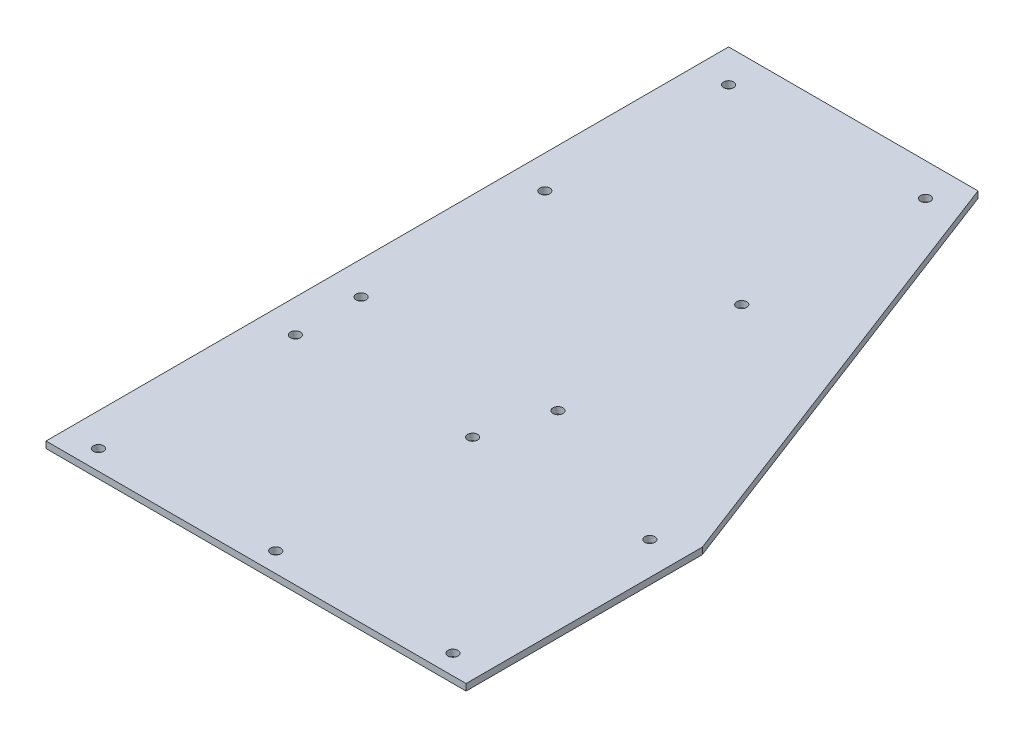
ISO-10303-21;
HEADER;
FILE_DESCRIPTION(('STEP AP214'),'2;1');
FILE_NAME('part.step','',(''),(''),'','','');
FILE_SCHEMA(('AUTOMOTIVE_DESIGN { 1 0 10303 214 1 1 1 1 }'));
ENDSEC;
DATA;
#1=APPLICATION_CONTEXT('core data for automotive mechanical design processes');
#2=APPLICATION_PROTOCOL_DEFINITION('international standard','automotive_design',2000,#1);
#3=PRODUCT_CONTEXT('',#1,'mechanical');
#4=PRODUCT('Part','Part','',(#3));
#5=PRODUCT_RELATED_PRODUCT_CATEGORY('part','',(#4));
#6=PRODUCT_DEFINITION_FORMATION('','',#4);
#7=PRODUCT_DEFINITION_CONTEXT('part definition',#1,'design');
#8=PRODUCT_DEFINITION('design','',#6,#7);
#9=PRODUCT_DEFINITION_SHAPE('','',#8);
#10=(LENGTH_UNIT() NAMED_UNIT(*) SI_UNIT(.MILLI.,.METRE.));
#11=(NAMED_UNIT(*) PLANE_ANGLE_UNIT() SI_UNIT($,.RADIAN.));
#12=(NAMED_UNIT(*) SI_UNIT($,.STERADIAN.) SOLID_ANGLE_UNIT());
#13=UNCERTAINTY_MEASURE_WITH_UNIT(LENGTH_MEASURE(1.E-05),#10,'distance_accuracy_value','');
#14=(GEOMETRIC_REPRESENTATION_CONTEXT(3) GLOBAL_UNCERTAINTY_ASSIGNED_CONTEXT((#13)) GLOBAL_UNIT_ASSIGNED_CONTEXT((#10,
#11,#12)) REPRESENTATION_CONTEXT('',''));
#15=CARTESIAN_POINT('',(0.,0.,0.));
#16=DIRECTION('',(0.,0.,1.));
#17=DIRECTION('',(1.,0.,0.));
#18=AXIS2_PLACEMENT_3D('',#15,#16,#17);
#19=CARTESIAN_POINT('',(0.,3.175,0.));
#20=DIRECTION('',(0.,-1.,0.));
#21=DIRECTION('',(0.,0.,-1.));
#22=AXIS2_PLACEMENT_3D('',#19,#20,#21);
#23=PLANE('',#22);
#24=DIRECTION('',(0.,0.,1.));
#25=VECTOR('',#24,1.);
#26=CARTESIAN_POINT('',(0.,3.175,0.));
#27=LINE('',#26,#25);
#28=CARTESIAN_POINT('',(0.,3.175,-330.2));
#29=VERTEX_POINT('',#28);
#30=CARTESIAN_POINT('',(0.,3.175,0.));
#31=VERTEX_POINT('',#30);
#32=EDGE_CURVE('E117',#29,#31,#27,.T.);
#33=ORIENTED_EDGE('',*,*,#32,.T.);
#34=DIRECTION('',(1.,0.,0.));
#35=VECTOR('',#34,1.);
#36=CARTESIAN_POINT('',(0.,3.175,0.));
#37=LINE('',#36,#35);
#38=CARTESIAN_POINT('',(203.2,3.175,0.));
#39=VERTEX_POINT('',#38);
#40=EDGE_CURVE('E84',#31,#39,#37,.T.);
#41=ORIENTED_EDGE('',*,*,#40,.T.);
#42=DIRECTION('',(0.,0.,-1.));
#43=VECTOR('',#42,1.);
#44=CARTESIAN_POINT('',(203.2,3.175,0.));
#45=LINE('',#44,#43);
#46=CARTESIAN_POINT('',(203.2,3.175,-114.3));
#47=VERTEX_POINT('',#46);
#48=EDGE_CURVE('E88',#39,#47,#45,.T.);
#49=ORIENTED_EDGE('',*,*,#48,.T.);
#50=DIRECTION('',(-0.357137466266591,0.,-0.934051834851085));
#51=VECTOR('',#50,1.);
#52=CARTESIAN_POINT('',(120.65,3.175,-330.2));
#53=LINE('',#52,#51);
#54=CARTESIAN_POINT('',(120.65,3.175,-330.2));
#55=VERTEX_POINT('',#54);
#56=EDGE_CURVE('E92',#47,#55,#53,.T.);
#57=ORIENTED_EDGE('',*,*,#56,.T.);
#58=DIRECTION('',(-1.,0.,0.));
#59=VECTOR('',#58,1.);
#60=CARTESIAN_POINT('',(0.,3.175,-330.2));
#61=LINE('',#60,#59);
#62=EDGE_CURVE('E50',#55,#29,#61,.T.);
#63=ORIENTED_EDGE('',*,*,#62,.T.);
#64=EDGE_LOOP('',(#33,#41,#49,#57,#63));
#65=FACE_BOUND('',#64,.T.);
#66=CARTESIAN_POINT('',(15.875,3.175,-9.525));
#67=DIRECTION('',(0.,1.,0.));
#68=DIRECTION('',(0.,0.,1.));
#69=AXIS2_PLACEMENT_3D('',#66,#67,#68);
#70=CIRCLE('',#69,2.4257);
#71=CARTESIAN_POINT('',(15.875,3.175,-7.0993));
#72=VERTEX_POINT('',#71);
#73=EDGE_CURVE('E112',#72,#72,#70,.T.);
#74=ORIENTED_EDGE('',*,*,#73,.F.);
#75=EDGE_LOOP('',(#74));
#76=FACE_BOUND('',#75,.T.);
#77=CARTESIAN_POINT('',(101.6,3.175,-9.525));
#78=DIRECTION('',(0.,1.,0.));
#79=DIRECTION('',(0.,0.,1.));
#80=AXIS2_PLACEMENT_3D('',#77,#78,#79);
#81=CIRCLE('',#80,2.4257);
#82=CARTESIAN_POINT('',(101.6,3.175,-7.0993));
#83=VERTEX_POINT('',#82);
#84=EDGE_CURVE('E256',#83,#83,#81,.T.);
#85=ORIENTED_EDGE('',*,*,#84,.F.);
#86=EDGE_LOOP('',(#85));
#87=FACE_BOUND('',#86,.T.);
#88=CARTESIAN_POINT('',(187.325,3.175,-9.525));
#89=DIRECTION('',(0.,1.,0.));
#90=DIRECTION('',(0.,0.,1.));
#91=AXIS2_PLACEMENT_3D('',#88,#89,#90);
#92=CIRCLE('',#91,2.4257);
#93=CARTESIAN_POINT('',(187.325,3.175,-7.0993));
#94=VERTEX_POINT('',#93);
#95=EDGE_CURVE('E250',#94,#94,#92,.T.);
#96=ORIENTED_EDGE('',*,*,#95,.F.);
#97=EDGE_LOOP('',(#96));
#98=FACE_BOUND('',#97,.T.);
#99=CARTESIAN_POINT('',(15.8749999999997,3.175,-104.775));
#100=DIRECTION('',(0.,1.,0.));
#101=DIRECTION('',(0.,0.,1.));
#102=AXIS2_PLACEMENT_3D('',#99,#100,#101);
#103=CIRCLE('',#102,2.4257);
#104=CARTESIAN_POINT('',(15.8749999999997,3.175,-102.3493));
#105=VERTEX_POINT('',#104);
#106=EDGE_CURVE('E244',#105,#105,#103,.T.);
#107=ORIENTED_EDGE('',*,*,#106,.F.);
#108=EDGE_LOOP('',(#107));
#109=FACE_BOUND('',#108,.T.);
#110=CARTESIAN_POINT('',(15.875,3.175,-136.525));
#111=DIRECTION('',(0.,1.,0.));
#112=DIRECTION('',(0.,0.,1.));
#113=AXIS2_PLACEMENT_3D('',#110,#111,#112);
#114=CIRCLE('',#113,2.42570000000001);
#115=CARTESIAN_POINT('',(15.875,3.175,-134.0993));
#116=VERTEX_POINT('',#115);
#117=EDGE_CURVE('E238',#116,#116,#114,.T.);
#118=ORIENTED_EDGE('',*,*,#117,.F.);
#119=EDGE_LOOP('',(#118));
#120=FACE_BOUND('',#119,.T.);
#121=CARTESIAN_POINT('',(187.325,3.175,-104.775));
#122=DIRECTION('',(0.,1.,0.));
#123=DIRECTION('',(0.,0.,1.));
#124=AXIS2_PLACEMENT_3D('',#121,#122,#123);
#125=CIRCLE('',#124,2.4257);
#126=CARTESIAN_POINT('',(187.325,3.175,-102.3493));
#127=VERTEX_POINT('',#126);
#128=EDGE_CURVE('E232',#127,#127,#125,.T.);
#129=ORIENTED_EDGE('',*,*,#128,.F.);
#130=EDGE_LOOP('',(#129));
#131=FACE_BOUND('',#130,.T.);
#132=CARTESIAN_POINT('',(101.6,3.175,-104.775));
#133=DIRECTION('',(0.,1.,0.));
#134=DIRECTION('',(0.,0.,1.));
#135=AXIS2_PLACEMENT_3D('',#132,#133,#134);
#136=CIRCLE('',#135,2.4257);
#137=CARTESIAN_POINT('',(101.6,3.175,-102.3493));
#138=VERTEX_POINT('',#137);
#139=EDGE_CURVE('E226',#138,#138,#136,.T.);
#140=ORIENTED_EDGE('',*,*,#139,.F.);
#141=EDGE_LOOP('',(#140));
#142=FACE_BOUND('',#141,.T.);
#143=CARTESIAN_POINT('',(111.125,3.175,-136.525));
#144=DIRECTION('',(0.,1.,0.));
#145=DIRECTION('',(0.,0.,1.));
#146=AXIS2_PLACEMENT_3D('',#143,#144,#145);
#147=CIRCLE('',#146,2.4257);
#148=CARTESIAN_POINT('',(111.125,3.175,-134.0993));
#149=VERTEX_POINT('',#148);
#150=EDGE_CURVE('E220',#149,#149,#147,.T.);
#151=ORIENTED_EDGE('',*,*,#150,.F.);
#152=EDGE_LOOP('',(#151));
#153=FACE_BOUND('',#152,.T.);
#154=CARTESIAN_POINT('',(15.875,3.175,-225.425));
#155=DIRECTION('',(0.,1.,0.));
#156=DIRECTION('',(0.,0.,1.));
#157=AXIS2_PLACEMENT_3D('',#154,#155,#156);
#158=CIRCLE('',#157,2.42570000000002);
#159=CARTESIAN_POINT('',(15.875,3.175,-222.9993));
#160=VERTEX_POINT('',#159);
#161=EDGE_CURVE('E214',#160,#160,#158,.T.);
#162=ORIENTED_EDGE('',*,*,#161,.F.);
#163=EDGE_LOOP('',(#162));
#164=FACE_BOUND('',#163,.T.);
#165=CARTESIAN_POINT('',(15.875,3.175,-314.325));
#166=DIRECTION('',(0.,1.,0.));
#167=DIRECTION('',(0.,0.,1.));
#168=AXIS2_PLACEMENT_3D('',#165,#166,#167);
#169=CIRCLE('',#168,2.42569999999998);
#170=CARTESIAN_POINT('',(15.875,3.175,-311.8993));
#171=VERTEX_POINT('',#170);
#172=EDGE_CURVE('E208',#171,#171,#169,.T.);
#173=ORIENTED_EDGE('',*,*,#172,.F.);
#174=EDGE_LOOP('',(#173));
#175=FACE_BOUND('',#174,.T.);
#176=CARTESIAN_POINT('',(111.125,3.175,-225.425));
#177=DIRECTION('',(0.,1.,0.));
#178=DIRECTION('',(0.,0.,1.));
#179=AXIS2_PLACEMENT_3D('',#176,#177,#178);
#180=CIRCLE('',#179,2.4257);
#181=CARTESIAN_POINT('',(111.125,3.175,-222.9993));
#182=VERTEX_POINT('',#181);
#183=EDGE_CURVE('E202',#182,#182,#180,.T.);
#184=ORIENTED_EDGE('',*,*,#183,.F.);
#185=EDGE_LOOP('',(#184));
#186=FACE_BOUND('',#185,.T.);
#187=CARTESIAN_POINT('',(111.125,3.175,-314.325));
#188=DIRECTION('',(0.,1.,0.));
#189=DIRECTION('',(0.,0.,1.));
#190=AXIS2_PLACEMENT_3D('',#187,#188,#189);
#191=CIRCLE('',#190,2.42569999999999);
#192=CARTESIAN_POINT('',(111.125,3.175,-311.8993));
#193=VERTEX_POINT('',#192);
#194=EDGE_CURVE('E193',#193,#193,#191,.T.);
#195=ORIENTED_EDGE('',*,*,#194,.F.);
#196=EDGE_LOOP('',(#195));
#197=FACE_BOUND('',#196,.T.);
#198=ADVANCED_FACE('F33',(#65,#76,#87,#98,#109,#120,#131,#142,#153,#164,#175,#186,#197),#23,.F.);
#199=CARTESIAN_POINT('',(0.,0.,0.));
#200=DIRECTION('',(0.,-1.,0.));
#201=DIRECTION('',(0.,0.,-1.));
#202=AXIS2_PLACEMENT_3D('',#199,#200,#201);
#203=PLANE('',#202);
#204=CARTESIAN_POINT('',(111.125,0.,-225.425));
#205=DIRECTION('',(0.,1.,0.));
#206=DIRECTION('',(0.,0.,1.));
#207=AXIS2_PLACEMENT_3D('',#204,#205,#206);
#208=CIRCLE('',#207,2.4257);
#209=CARTESIAN_POINT('',(111.125,0.,-222.9993));
#210=VERTEX_POINT('',#209);
#211=EDGE_CURVE('E199',#210,#210,#208,.T.);
#212=ORIENTED_EDGE('',*,*,#211,.T.);
#213=EDGE_LOOP('',(#212));
#214=FACE_BOUND('',#213,.T.);
#215=CARTESIAN_POINT('',(15.875,0.,-225.425));
#216=DIRECTION('',(0.,1.,0.));
#217=DIRECTION('',(0.,0.,1.));
#218=AXIS2_PLACEMENT_3D('',#215,#216,#217);
#219=CIRCLE('',#218,2.42570000000002);
#220=CARTESIAN_POINT('',(15.875,0.,-222.9993));
#221=VERTEX_POINT('',#220);
#222=EDGE_CURVE('E211',#221,#221,#219,.T.);
#223=ORIENTED_EDGE('',*,*,#222,.T.);
#224=EDGE_LOOP('',(#223));
#225=FACE_BOUND('',#224,.T.);
#226=CARTESIAN_POINT('',(101.6,0.,-104.775));
#227=DIRECTION('',(0.,1.,0.));
#228=DIRECTION('',(0.,0.,1.));
#229=AXIS2_PLACEMENT_3D('',#226,#227,#228);
#230=CIRCLE('',#229,2.4257);
#231=CARTESIAN_POINT('',(101.6,0.,-102.3493));
#232=VERTEX_POINT('',#231);
#233=EDGE_CURVE('E223',#232,#232,#230,.T.);
#234=ORIENTED_EDGE('',*,*,#233,.T.);
#235=EDGE_LOOP('',(#234));
#236=FACE_BOUND('',#235,.T.);
#237=CARTESIAN_POINT('',(15.875,0.,-136.525));
#238=DIRECTION('',(0.,1.,0.));
#239=DIRECTION('',(0.,0.,1.));
#240=AXIS2_PLACEMENT_3D('',#237,#238,#239);
#241=CIRCLE('',#240,2.42570000000001);
#242=CARTESIAN_POINT('',(15.875,0.,-134.0993));
#243=VERTEX_POINT('',#242);
#244=EDGE_CURVE('E235',#243,#243,#241,.T.);
#245=ORIENTED_EDGE('',*,*,#244,.T.);
#246=EDGE_LOOP('',(#245));
#247=FACE_BOUND('',#246,.T.);
#248=CARTESIAN_POINT('',(187.325,0.,-9.525));
#249=DIRECTION('',(0.,1.,0.));
#250=DIRECTION('',(0.,0.,1.));
#251=AXIS2_PLACEMENT_3D('',#248,#249,#250);
#252=CIRCLE('',#251,2.4257);
#253=CARTESIAN_POINT('',(187.325,0.,-7.0993));
#254=VERTEX_POINT('',#253);
#255=EDGE_CURVE('E247',#254,#254,#252,.T.);
#256=ORIENTED_EDGE('',*,*,#255,.T.);
#257=EDGE_LOOP('',(#256));
#258=FACE_BOUND('',#257,.T.);
#259=CARTESIAN_POINT('',(15.875,0.,-9.525));
#260=DIRECTION('',(0.,1.,0.));
#261=DIRECTION('',(0.,0.,1.));
#262=AXIS2_PLACEMENT_3D('',#259,#260,#261);
#263=CIRCLE('',#262,2.4257);
#264=CARTESIAN_POINT('',(15.875,0.,-7.0993));
#265=VERTEX_POINT('',#264);
#266=EDGE_CURVE('E259',#265,#265,#263,.T.);
#267=ORIENTED_EDGE('',*,*,#266,.T.);
#268=EDGE_LOOP('',(#267));
#269=FACE_BOUND('',#268,.T.);
#270=DIRECTION('',(0.,0.,1.));
#271=VECTOR('',#270,1.);
#272=CARTESIAN_POINT('',(0.,0.,0.));
#273=LINE('',#272,#271);
#274=CARTESIAN_POINT('',(0.,0.,-330.2));
#275=VERTEX_POINT('',#274);
#276=CARTESIAN_POINT('',(0.,0.,0.));
#277=VERTEX_POINT('',#276);
#278=EDGE_CURVE('E108',#275,#277,#273,.T.);
#279=ORIENTED_EDGE('',*,*,#278,.F.);
#280=DIRECTION('',(-1.,0.,0.));
#281=VECTOR('',#280,1.);
#282=CARTESIAN_POINT('',(0.,0.,-330.2));
#283=LINE('',#282,#281);
#284=CARTESIAN_POINT('',(120.65,0.,-330.2));
#285=VERTEX_POINT('',#284);
#286=EDGE_CURVE('E76',#285,#275,#283,.T.);
#287=ORIENTED_EDGE('',*,*,#286,.F.);
#288=DIRECTION('',(-0.357137466266591,0.,-0.934051834851085));
#289=VECTOR('',#288,1.);
#290=CARTESIAN_POINT('',(120.65,0.,-330.2));
#291=LINE('',#290,#289);
#292=CARTESIAN_POINT('',(203.2,0.,-114.3));
#293=VERTEX_POINT('',#292);
#294=EDGE_CURVE('E70',#293,#285,#291,.T.);
#295=ORIENTED_EDGE('',*,*,#294,.F.);
#296=DIRECTION('',(0.,0.,-1.));
#297=VECTOR('',#296,1.);
#298=CARTESIAN_POINT('',(203.2,0.,0.));
#299=LINE('',#298,#297);
#300=CARTESIAN_POINT('',(203.2,0.,0.));
#301=VERTEX_POINT('',#300);
#302=EDGE_CURVE('E99',#301,#293,#299,.T.);
#303=ORIENTED_EDGE('',*,*,#302,.F.);
#304=DIRECTION('',(1.,0.,0.));
#305=VECTOR('',#304,1.);
#306=CARTESIAN_POINT('',(0.,0.,0.));
#307=LINE('',#306,#305);
#308=EDGE_CURVE('E111',#277,#301,#307,.T.);
#309=ORIENTED_EDGE('',*,*,#308,.F.);
#310=EDGE_LOOP('',(#279,#287,#295,#303,#309));
#311=FACE_BOUND('',#310,.T.);
#312=CARTESIAN_POINT('',(101.6,0.,-9.525));
#313=DIRECTION('',(0.,1.,0.));
#314=DIRECTION('',(0.,0.,1.));
#315=AXIS2_PLACEMENT_3D('',#312,#313,#314);
#316=CIRCLE('',#315,2.4257);
#317=CARTESIAN_POINT('',(101.6,0.,-7.0993));
#318=VERTEX_POINT('',#317);
#319=EDGE_CURVE('E253',#318,#318,#316,.T.);
#320=ORIENTED_EDGE('',*,*,#319,.T.);
#321=EDGE_LOOP('',(#320));
#322=FACE_BOUND('',#321,.T.);
#323=CARTESIAN_POINT('',(15.8749999999997,0.,-104.775));
#324=DIRECTION('',(0.,1.,0.));
#325=DIRECTION('',(0.,0.,1.));
#326=AXIS2_PLACEMENT_3D('',#323,#324,#325);
#327=CIRCLE('',#326,2.4257);
#328=CARTESIAN_POINT('',(15.8749999999997,0.,-102.3493));
#329=VERTEX_POINT('',#328);
#330=EDGE_CURVE('E241',#329,#329,#327,.T.);
#331=ORIENTED_EDGE('',*,*,#330,.T.);
#332=EDGE_LOOP('',(#331));
#333=FACE_BOUND('',#332,.T.);
#334=CARTESIAN_POINT('',(187.325,0.,-104.775));
#335=DIRECTION('',(0.,1.,0.));
#336=DIRECTION('',(0.,0.,1.));
#337=AXIS2_PLACEMENT_3D('',#334,#335,#336);
#338=CIRCLE('',#337,2.4257);
#339=CARTESIAN_POINT('',(187.325,0.,-102.3493));
#340=VERTEX_POINT('',#339);
#341=EDGE_CURVE('E229',#340,#340,#338,.T.);
#342=ORIENTED_EDGE('',*,*,#341,.T.);
#343=EDGE_LOOP('',(#342));
#344=FACE_BOUND('',#343,.T.);
#345=CARTESIAN_POINT('',(111.125,0.,-136.525));
#346=DIRECTION('',(0.,1.,0.));
#347=DIRECTION('',(0.,0.,1.));
#348=AXIS2_PLACEMENT_3D('',#345,#346,#347);
#349=CIRCLE('',#348,2.4257);
#350=CARTESIAN_POINT('',(111.125,0.,-134.0993));
#351=VERTEX_POINT('',#350);
#352=EDGE_CURVE('E217',#351,#351,#349,.T.);
#353=ORIENTED_EDGE('',*,*,#352,.T.);
#354=EDGE_LOOP('',(#353));
#355=FACE_BOUND('',#354,.T.);
#356=CARTESIAN_POINT('',(15.875,0.,-314.325));
#357=DIRECTION('',(0.,1.,0.));
#358=DIRECTION('',(0.,0.,1.));
#359=AXIS2_PLACEMENT_3D('',#356,#357,#358);
#360=CIRCLE('',#359,2.42569999999998);
#361=CARTESIAN_POINT('',(15.875,0.,-311.8993));
#362=VERTEX_POINT('',#361);
#363=EDGE_CURVE('E205',#362,#362,#360,.T.);
#364=ORIENTED_EDGE('',*,*,#363,.T.);
#365=EDGE_LOOP('',(#364));
#366=FACE_BOUND('',#365,.T.);
#367=CARTESIAN_POINT('',(111.125,0.,-314.325));
#368=DIRECTION('',(0.,1.,0.));
#369=DIRECTION('',(0.,0.,1.));
#370=AXIS2_PLACEMENT_3D('',#367,#368,#369);
#371=CIRCLE('',#370,2.42569999999999);
#372=CARTESIAN_POINT('',(111.125,0.,-311.8993));
#373=VERTEX_POINT('',#372);
#374=EDGE_CURVE('E196',#373,#373,#371,.T.);
#375=ORIENTED_EDGE('',*,*,#374,.T.);
#376=EDGE_LOOP('',(#375));
#377=FACE_BOUND('',#376,.T.);
#378=ADVANCED_FACE('F121',(#214,#225,#236,#247,#258,#269,#311,#322,#333,#344,#355,#366,#377),
#203,.T.);
#379=CARTESIAN_POINT('',(0.,3.175,0.));
#380=DIRECTION('',(1.,0.,0.));
#381=DIRECTION('',(0.,0.,-1.));
#382=AXIS2_PLACEMENT_3D('',#379,#380,#381);
#383=PLANE('',#382);
#384=ORIENTED_EDGE('',*,*,#278,.T.);
#385=DIRECTION('',(0.,-1.,0.));
#386=VECTOR('',#385,1.);
#387=CARTESIAN_POINT('',(0.,3.175,0.));
#388=LINE('',#387,#386);
#389=EDGE_CURVE('E11',#31,#277,#388,.T.);
#390=ORIENTED_EDGE('',*,*,#389,.F.);
#391=ORIENTED_EDGE('',*,*,#32,.F.);
#392=DIRECTION('',(0.,-1.,0.));
#393=VECTOR('',#392,1.);
#394=CARTESIAN_POINT('',(0.,3.175,-330.2));
#395=LINE('',#394,#393);
#396=EDGE_CURVE('E104',#29,#275,#395,.T.);
#397=ORIENTED_EDGE('',*,*,#396,.T.);
#398=EDGE_LOOP('',(#384,#390,#391,#397));
#399=FACE_BOUND('',#398,.T.);
#400=ADVANCED_FACE('F35',(#399),#383,.F.);
#401=CARTESIAN_POINT('',(0.,3.175,0.));
#402=DIRECTION('',(0.,0.,-1.));
#403=DIRECTION('',(-1.,0.,0.));
#404=AXIS2_PLACEMENT_3D('',#401,#402,#403);
#405=PLANE('',#404);
#406=ORIENTED_EDGE('',*,*,#308,.T.);
#407=DIRECTION('',(0.,-1.,0.));
#408=VECTOR('',#407,1.);
#409=CARTESIAN_POINT('',(203.2,3.175,0.));
#410=LINE('',#409,#408);
#411=EDGE_CURVE('E42',#39,#301,#410,.T.);
#412=ORIENTED_EDGE('',*,*,#411,.F.);
#413=ORIENTED_EDGE('',*,*,#40,.F.);
#414=ORIENTED_EDGE('',*,*,#389,.T.);
#415=EDGE_LOOP('',(#406,#412,#413,#414));
#416=FACE_BOUND('',#415,.T.);
#417=ADVANCED_FACE('F382',(#416),#405,.F.);
#418=CARTESIAN_POINT('',(203.2,3.175,0.));
#419=DIRECTION('',(-1.,0.,0.));
#420=DIRECTION('',(0.,0.,1.));
#421=AXIS2_PLACEMENT_3D('',#418,#419,#420);
#422=PLANE('',#421);
#423=ORIENTED_EDGE('',*,*,#302,.T.);
#424=DIRECTION('',(0.,-1.,0.));
#425=VECTOR('',#424,1.);
#426=CARTESIAN_POINT('',(203.2,3.175,-114.3));
#427=LINE('',#426,#425);
#428=EDGE_CURVE('E96',#47,#293,#427,.T.);
#429=ORIENTED_EDGE('',*,*,#428,.F.);
#430=ORIENTED_EDGE('',*,*,#48,.F.);
#431=ORIENTED_EDGE('',*,*,#411,.T.);
#432=EDGE_LOOP('',(#423,#429,#430,#431));
#433=FACE_BOUND('',#432,.T.);
#434=ADVANCED_FACE('F97',(#433),#422,.F.);
#435=CARTESIAN_POINT('',(120.65,3.175,-330.2));
#436=DIRECTION('',(-0.934051834851085,0.,0.357137466266591));
#437=DIRECTION('',(0.357137466266591,0.,0.934051834851085));
#438=AXIS2_PLACEMENT_3D('',#435,#436,#437);
#439=PLANE('',#438);
#440=ORIENTED_EDGE('',*,*,#294,.T.);
#441=DIRECTION('',(0.,-1.,0.));
#442=VECTOR('',#441,1.);
#443=CARTESIAN_POINT('',(120.65,3.175,-330.2));
#444=LINE('',#443,#442);
#445=EDGE_CURVE('E100',#55,#285,#444,.T.);
#446=ORIENTED_EDGE('',*,*,#445,.F.);
#447=ORIENTED_EDGE('',*,*,#56,.F.);
#448=ORIENTED_EDGE('',*,*,#428,.T.);
#449=EDGE_LOOP('',(#440,#446,#447,#448));
#450=FACE_BOUND('',#449,.T.);
#451=ADVANCED_FACE('F102',(#450),#439,.F.);
#452=CARTESIAN_POINT('',(0.,3.175,-330.2));
#453=DIRECTION('',(0.,0.,1.));
#454=DIRECTION('',(1.,0.,0.));
#455=AXIS2_PLACEMENT_3D('',#452,#453,#454);
#456=PLANE('',#455);
#457=ORIENTED_EDGE('',*,*,#286,.T.);
#458=ORIENTED_EDGE('',*,*,#396,.F.);
#459=ORIENTED_EDGE('',*,*,#62,.F.);
#460=ORIENTED_EDGE('',*,*,#445,.T.);
#461=EDGE_LOOP('',(#457,#458,#459,#460));
#462=FACE_BOUND('',#461,.T.);
#463=ADVANCED_FACE('F126',(#462),#456,.F.);
#464=CARTESIAN_POINT('',(15.875,3.175,-9.525));
#465=DIRECTION('',(0.,-1.,0.));
#466=DIRECTION('',(0.,0.,-1.));
#467=AXIS2_PLACEMENT_3D('',#464,#465,#466);
#468=CYLINDRICAL_SURFACE('',#467,2.4257);
#469=ORIENTED_EDGE('',*,*,#73,.T.);
#470=EDGE_LOOP('',(#469));
#471=FACE_BOUND('',#470,.T.);
#472=ORIENTED_EDGE('',*,*,#266,.F.);
#473=EDGE_LOOP('',(#472));
#474=FACE_BOUND('',#473,.T.);
#475=ADVANCED_FACE('F128',(#471,#474),#468,.F.);
#476=CARTESIAN_POINT('',(101.6,3.175,-9.525));
#477=DIRECTION('',(0.,-1.,0.));
#478=DIRECTION('',(0.,0.,-1.));
#479=AXIS2_PLACEMENT_3D('',#476,#477,#478);
#480=CYLINDRICAL_SURFACE('',#479,2.4257);
#481=ORIENTED_EDGE('',*,*,#84,.T.);
#482=EDGE_LOOP('',(#481));
#483=FACE_BOUND('',#482,.T.);
#484=ORIENTED_EDGE('',*,*,#319,.F.);
#485=EDGE_LOOP('',(#484));
#486=FACE_BOUND('',#485,.T.);
#487=ADVANCED_FACE('F134',(#483,#486),#480,.F.);
#488=CARTESIAN_POINT('',(187.325,3.175,-9.525));
#489=DIRECTION('',(0.,-1.,0.));
#490=DIRECTION('',(0.,0.,-1.));
#491=AXIS2_PLACEMENT_3D('',#488,#489,#490);
#492=CYLINDRICAL_SURFACE('',#491,2.4257);
#493=ORIENTED_EDGE('',*,*,#95,.T.);
#494=EDGE_LOOP('',(#493));
#495=FACE_BOUND('',#494,.T.);
#496=ORIENTED_EDGE('',*,*,#255,.F.);
#497=EDGE_LOOP('',(#496));
#498=FACE_BOUND('',#497,.T.);
#499=ADVANCED_FACE('F148',(#495,#498),#492,.F.);
#500=CARTESIAN_POINT('',(15.8749999999997,3.175,-104.775));
#501=DIRECTION('',(0.,-1.,0.));
#502=DIRECTION('',(0.,0.,-1.));
#503=AXIS2_PLACEMENT_3D('',#500,#501,#502);
#504=CYLINDRICAL_SURFACE('',#503,2.4257);
#505=ORIENTED_EDGE('',*,*,#106,.T.);
#506=EDGE_LOOP('',(#505));
#507=FACE_BOUND('',#506,.T.);
#508=ORIENTED_EDGE('',*,*,#330,.F.);
#509=EDGE_LOOP('',(#508));
#510=FACE_BOUND('',#509,.T.);
#511=ADVANCED_FACE('F152',(#507,#510),#504,.F.);
#512=CARTESIAN_POINT('',(15.875,3.175,-136.525));
#513=DIRECTION('',(0.,-1.,0.));
#514=DIRECTION('',(0.,0.,-1.));
#515=AXIS2_PLACEMENT_3D('',#512,#513,#514);
#516=CYLINDRICAL_SURFACE('',#515,2.42570000000001);
#517=ORIENTED_EDGE('',*,*,#117,.T.);
#518=EDGE_LOOP('',(#517));
#519=FACE_BOUND('',#518,.T.);
#520=ORIENTED_EDGE('',*,*,#244,.F.);
#521=EDGE_LOOP('',(#520));
#522=FACE_BOUND('',#521,.T.);
#523=ADVANCED_FACE('F156',(#519,#522),#516,.F.);
#524=CARTESIAN_POINT('',(187.325,3.175,-104.775));
#525=DIRECTION('',(0.,-1.,0.));
#526=DIRECTION('',(0.,0.,-1.));
#527=AXIS2_PLACEMENT_3D('',#524,#525,#526);
#528=CYLINDRICAL_SURFACE('',#527,2.4257);
#529=ORIENTED_EDGE('',*,*,#128,.T.);
#530=EDGE_LOOP('',(#529));
#531=FACE_BOUND('',#530,.T.);
#532=ORIENTED_EDGE('',*,*,#341,.F.);
#533=EDGE_LOOP('',(#532));
#534=FACE_BOUND('',#533,.T.);
#535=ADVANCED_FACE('F160',(#531,#534),#528,.F.);
#536=CARTESIAN_POINT('',(101.6,3.175,-104.775));
#537=DIRECTION('',(0.,-1.,0.));
#538=DIRECTION('',(0.,0.,-1.));
#539=AXIS2_PLACEMENT_3D('',#536,#537,#538);
#540=CYLINDRICAL_SURFACE('',#539,2.4257);
#541=ORIENTED_EDGE('',*,*,#139,.T.);
#542=EDGE_LOOP('',(#541));
#543=FACE_BOUND('',#542,.T.);
#544=ORIENTED_EDGE('',*,*,#233,.F.);
#545=EDGE_LOOP('',(#544));
#546=FACE_BOUND('',#545,.T.);
#547=ADVANCED_FACE('F164',(#543,#546),#540,.F.);
#548=CARTESIAN_POINT('',(111.125,3.175,-136.525));
#549=DIRECTION('',(0.,-1.,0.));
#550=DIRECTION('',(0.,0.,-1.));
#551=AXIS2_PLACEMENT_3D('',#548,#549,#550);
#552=CYLINDRICAL_SURFACE('',#551,2.4257);
#553=ORIENTED_EDGE('',*,*,#150,.T.);
#554=EDGE_LOOP('',(#553));
#555=FACE_BOUND('',#554,.T.);
#556=ORIENTED_EDGE('',*,*,#352,.F.);
#557=EDGE_LOOP('',(#556));
#558=FACE_BOUND('',#557,.T.);
#559=ADVANCED_FACE('F168',(#555,#558),#552,.F.);
#560=CARTESIAN_POINT('',(15.875,3.175,-225.425));
#561=DIRECTION('',(0.,-1.,0.));
#562=DIRECTION('',(0.,0.,-1.));
#563=AXIS2_PLACEMENT_3D('',#560,#561,#562);
#564=CYLINDRICAL_SURFACE('',#563,2.42570000000002);
#565=ORIENTED_EDGE('',*,*,#161,.T.);
#566=EDGE_LOOP('',(#565));
#567=FACE_BOUND('',#566,.T.);
#568=ORIENTED_EDGE('',*,*,#222,.F.);
#569=EDGE_LOOP('',(#568));
#570=FACE_BOUND('',#569,.T.);
#571=ADVANCED_FACE('F172',(#567,#570),#564,.F.);
#572=CARTESIAN_POINT('',(15.875,3.175,-314.325));
#573=DIRECTION('',(0.,-1.,0.));
#574=DIRECTION('',(0.,0.,-1.));
#575=AXIS2_PLACEMENT_3D('',#572,#573,#574);
#576=CYLINDRICAL_SURFACE('',#575,2.42569999999998);
#577=ORIENTED_EDGE('',*,*,#172,.T.);
#578=EDGE_LOOP('',(#577));
#579=FACE_BOUND('',#578,.T.);
#580=ORIENTED_EDGE('',*,*,#363,.F.);
#581=EDGE_LOOP('',(#580));
#582=FACE_BOUND('',#581,.T.);
#583=ADVANCED_FACE('F176',(#579,#582),#576,.F.);
#584=CARTESIAN_POINT('',(111.125,3.175,-225.425));
#585=DIRECTION('',(0.,-1.,0.));
#586=DIRECTION('',(0.,0.,-1.));
#587=AXIS2_PLACEMENT_3D('',#584,#585,#586);
#588=CYLINDRICAL_SURFACE('',#587,2.4257);
#589=ORIENTED_EDGE('',*,*,#183,.T.);
#590=EDGE_LOOP('',(#589));
#591=FACE_BOUND('',#590,.T.);
#592=ORIENTED_EDGE('',*,*,#211,.F.);
#593=EDGE_LOOP('',(#592));
#594=FACE_BOUND('',#593,.T.);
#595=ADVANCED_FACE('F180',(#591,#594),#588,.F.);
#596=CARTESIAN_POINT('',(111.125,3.175,-314.325));
#597=DIRECTION('',(0.,-1.,0.));
#598=DIRECTION('',(0.,0.,-1.));
#599=AXIS2_PLACEMENT_3D('',#596,#597,#598);
#600=CYLINDRICAL_SURFACE('',#599,2.42569999999999);
#601=ORIENTED_EDGE('',*,*,#194,.T.);
#602=EDGE_LOOP('',(#601));
#603=FACE_BOUND('',#602,.T.);
#604=ORIENTED_EDGE('',*,*,#374,.F.);
#605=EDGE_LOOP('',(#604));
#606=FACE_BOUND('',#605,.T.);
#607=ADVANCED_FACE('F184',(#603,#606),#600,.F.);
#608=CLOSED_SHELL('',(#198,#378,#400,#417,#434,#451,#463,#475,#487,#499,#511,#523,#535,#547,
#559,#571,#583,#595,#607));
#609=MANIFOLD_SOLID_BREP('B2',#608);
#610=ADVANCED_BREP_SHAPE_REPRESENTATION('',(#18,#609),#14);
#611=SHAPE_DEFINITION_REPRESENTATION(#9,#610);
ENDSEC;
END-ISO-10303-21;
